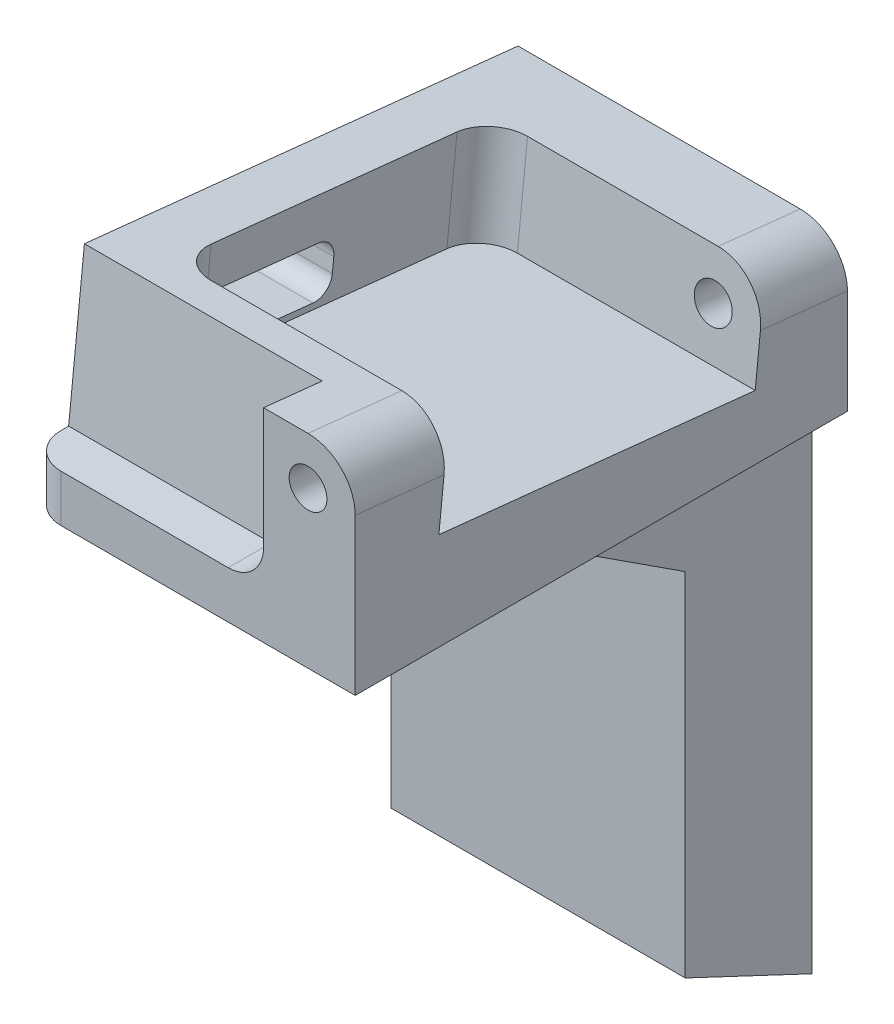
ISO-10303-21;
HEADER;
FILE_DESCRIPTION(('STEP AP214'),'2;1');
FILE_NAME('part.step','',(''),(''),'','','');
FILE_SCHEMA(('AUTOMOTIVE_DESIGN { 1 0 10303 214 1 1 1 1 }'));
ENDSEC;
DATA;
#1=APPLICATION_CONTEXT('core data for automotive mechanical design processes');
#2=APPLICATION_PROTOCOL_DEFINITION('international standard','automotive_design',2000,#1);
#3=PRODUCT_CONTEXT('',#1,'mechanical');
#4=PRODUCT('Part','Part','',(#3));
#5=PRODUCT_RELATED_PRODUCT_CATEGORY('part','',(#4));
#6=PRODUCT_DEFINITION_FORMATION('','',#4);
#7=PRODUCT_DEFINITION_CONTEXT('part definition',#1,'design');
#8=PRODUCT_DEFINITION('design','',#6,#7);
#9=PRODUCT_DEFINITION_SHAPE('','',#8);
#10=(LENGTH_UNIT() NAMED_UNIT(*) SI_UNIT(.MILLI.,.METRE.));
#11=(NAMED_UNIT(*) PLANE_ANGLE_UNIT() SI_UNIT($,.RADIAN.));
#12=(NAMED_UNIT(*) SI_UNIT($,.STERADIAN.) SOLID_ANGLE_UNIT());
#13=UNCERTAINTY_MEASURE_WITH_UNIT(LENGTH_MEASURE(1.E-05),#10,'distance_accuracy_value','');
#14=(GEOMETRIC_REPRESENTATION_CONTEXT(3) GLOBAL_UNCERTAINTY_ASSIGNED_CONTEXT((#13)) GLOBAL_UNIT_ASSIGNED_CONTEXT((#10,
#11,#12)) REPRESENTATION_CONTEXT('',''));
#15=CARTESIAN_POINT('',(0.,0.,0.));
#16=DIRECTION('',(0.,0.,1.));
#17=DIRECTION('',(1.,0.,0.));
#18=AXIS2_PLACEMENT_3D('',#15,#16,#17);
#19=CARTESIAN_POINT('',(11.47,215.631716961282,93.648194247594));
#20=DIRECTION('',(0.,0.10452846326765,0.994521895368274));
#21=DIRECTION('',(0.,-0.994521895368274,0.10452846326765));
#22=AXIS2_PLACEMENT_3D('',#19,#20,#21);
#23=CYLINDRICAL_SURFACE('',#22,3.99999999999999);
#24=DIRECTION('',(0.,0.10452846326765,0.994521895368274));
#25=VECTOR('',#24,1.);
#26=CARTESIAN_POINT('',(15.47,215.587771424514,93.2300803945325));
#27=LINE('',#26,#25);
#28=CARTESIAN_POINT('',(15.47,219.185684712395,127.461938690124));
#29=VERTEX_POINT('',#28);
#30=CARTESIAN_POINT('',(15.47,219.977966881755,135.));
#31=VERTEX_POINT('',#30);
#32=EDGE_CURVE('E461',#29,#31,#27,.T.);
#33=ORIENTED_EDGE('',*,*,#32,.F.);
#34=CARTESIAN_POINT('',(11.47,219.185684712384,127.461938690125));
#35=DIRECTION('',(0.,0.10452846326765,0.994521895368274));
#36=DIRECTION('',(0.,-0.994521895368274,0.10452846326765));
#37=AXIS2_PLACEMENT_3D('',#34,#35,#36);
#38=CIRCLE('',#37,3.99999999999999);
#39=CARTESIAN_POINT('',(11.47,223.163772293859,127.043824837054));
#40=VERTEX_POINT('',#39);
#41=EDGE_CURVE('E365',#29,#40,#38,.T.);
#42=ORIENTED_EDGE('',*,*,#41,.T.);
#43=DIRECTION('',(0.,0.10452846326765,0.994521895368274));
#44=VECTOR('',#43,1.);
#45=CARTESIAN_POINT('',(11.47,224.,135.));
#46=LINE('',#45,#44);
#47=CARTESIAN_POINT('',(11.47,223.999999999997,134.999999999991));
#48=VERTEX_POINT('',#47);
#49=EDGE_CURVE('E475',#40,#48,#46,.T.);
#50=ORIENTED_EDGE('',*,*,#49,.T.);
#51=CARTESIAN_POINT('',(11.47,223.999999999997,134.999999999991));
#52=CARTESIAN_POINT('',(13.8131457505076,223.999999999997,134.999999999991));
#53=CARTESIAN_POINT('',(15.47,222.334019334102,134.999999999991));
#54=CARTESIAN_POINT('',(15.47,219.977966881743,134.999999999991));
#55=(BOUNDED_CURVE() B_SPLINE_CURVE(3,(#51,#52,#53,#54),.UNSPECIFIED.,.F.,
.F.) B_SPLINE_CURVE_WITH_KNOTS((4,4),(0.,1.),
.UNSPECIFIED.) CURVE() GEOMETRIC_REPRESENTATION_ITEM() RATIONAL_B_SPLINE_CURVE((1.,
0.804737854124365,0.804737854124365,1.)) REPRESENTATION_ITEM(''));
#56=EDGE_CURVE('E455',#48,#31,#55,.T.);
#57=ORIENTED_EDGE('',*,*,#56,.T.);
#58=EDGE_LOOP('',(#33,#42,#50,#57));
#59=FACE_BOUND('',#58,.T.);
#60=ADVANCED_FACE('F39',(#59),#23,.T.);
#61=CARTESIAN_POINT('',(11.47,215.11552041079,88.7369121361922));
#62=DIRECTION('',(0.,0.10452846326765,0.994521895368274));
#63=DIRECTION('',(0.,-0.994521895368274,0.10452846326765));
#64=AXIS2_PLACEMENT_3D('',#61,#62,#63);
#65=CYLINDRICAL_SURFACE('',#64,1.59999999999996);
#66=CARTESIAN_POINT('',(11.47,219.185684712384,127.461938690125));
#67=DIRECTION('',(0.,0.10452846326765,0.994521895368274));
#68=DIRECTION('',(0.,-0.994521895368274,0.10452846326765));
#69=AXIS2_PLACEMENT_3D('',#66,#67,#68);
#70=CIRCLE('',#69,1.59999999999996);
#71=CARTESIAN_POINT('',(11.47,217.594449679794,127.629184231353));
#72=VERTEX_POINT('',#71);
#73=EDGE_CURVE('E364',#72,#72,#70,.F.);
#74=ORIENTED_EDGE('',*,*,#73,.T.);
#75=EDGE_LOOP('',(#74));
#76=FACE_BOUND('',#75,.T.);
#77=CARTESIAN_POINT('',(11.47,219.977966881744,135.));
#78=DIRECTION('',(0.,0.,-1.));
#79=DIRECTION('',(0.,1.,0.));
#80=AXIS2_PLACEMENT_3D('',#77,#78,#79);
#81=ELLIPSE('',#80,1.60881324730159,1.59999999999996);
#82=CARTESIAN_POINT('',(11.47,221.586780129045,135.));
#83=VERTEX_POINT('',#82);
#84=EDGE_CURVE('E373',#83,#83,#81,.T.);
#85=ORIENTED_EDGE('',*,*,#84,.F.);
#86=EDGE_LOOP('',(#85));
#87=FACE_BOUND('',#86,.T.);
#88=ADVANCED_FACE('F642',(#76,#87),#65,.F.);
#89=CARTESIAN_POINT('',(11.47,206.75,135.));
#90=DIRECTION('',(0.,1.,0.));
#91=DIRECTION('',(0.,0.,1.));
#92=AXIS2_PLACEMENT_3D('',#89,#90,#91);
#93=PLANE('',#92);
#94=DIRECTION('',(-1.,0.,0.));
#95=VECTOR('',#94,1.);
#96=CARTESIAN_POINT('',(11.47,206.75,135.));
#97=LINE('',#96,#95);
#98=CARTESIAN_POINT('',(15.47,206.75,135.));
#99=VERTEX_POINT('',#98);
#100=CARTESIAN_POINT('',(-9.46999999999999,206.75,135.));
#101=VERTEX_POINT('',#100);
#102=EDGE_CURVE('E513',#99,#101,#97,.T.);
#103=ORIENTED_EDGE('',*,*,#102,.T.);
#104=CARTESIAN_POINT('',(-9.47,206.75,132.));
#105=DIRECTION('',(0.,1.,0.));
#106=DIRECTION('',(0.,0.,1.));
#107=AXIS2_PLACEMENT_3D('',#104,#105,#106);
#108=CIRCLE('',#107,3.);
#109=CARTESIAN_POINT('',(-12.47,206.75,132.));
#110=VERTEX_POINT('',#109);
#111=EDGE_CURVE('E524',#101,#110,#108,.F.);
#112=ORIENTED_EDGE('',*,*,#111,.T.);
#113=DIRECTION('',(0.,0.,-1.));
#114=VECTOR('',#113,1.);
#115=CARTESIAN_POINT('',(-12.47,206.75,135.));
#116=LINE('',#115,#114);
#117=CARTESIAN_POINT('',(-12.47,206.75,116.178095191841));
#118=VERTEX_POINT('',#117);
#119=EDGE_CURVE('E479',#110,#118,#116,.T.);
#120=ORIENTED_EDGE('',*,*,#119,.T.);
#121=DIRECTION('',(-1.,0.,0.));
#122=VECTOR('',#121,1.);
#123=CARTESIAN_POINT('',(11.47,206.75,116.178095191841));
#124=LINE('',#123,#122);
#125=CARTESIAN_POINT('',(12.47,206.75,116.178095191841));
#126=VERTEX_POINT('',#125);
#127=EDGE_CURVE('E509',#126,#118,#124,.T.);
#128=ORIENTED_EDGE('',*,*,#127,.F.);
#129=DIRECTION('',(0.,0.,1.));
#130=VECTOR('',#129,1.);
#131=CARTESIAN_POINT('',(12.47,206.75,116.178095191841));
#132=LINE('',#131,#130);
#133=CARTESIAN_POINT('',(12.47,206.75,93.2499999999999));
#134=VERTEX_POINT('',#133);
#135=EDGE_CURVE('E421',#134,#126,#132,.T.);
#136=ORIENTED_EDGE('',*,*,#135,.F.);
#137=DIRECTION('',(-1.,0.,0.));
#138=VECTOR('',#137,1.);
#139=CARTESIAN_POINT('',(15.47,206.75,93.2499999999999));
#140=LINE('',#139,#138);
#141=CARTESIAN_POINT('',(15.47,206.75,93.2499999999999));
#142=VERTEX_POINT('',#141);
#143=EDGE_CURVE('E448',#142,#134,#140,.T.);
#144=ORIENTED_EDGE('',*,*,#143,.F.);
#145=DIRECTION('',(0.,0.,-1.));
#146=VECTOR('',#145,1.);
#147=CARTESIAN_POINT('',(15.47,206.75,135.));
#148=LINE('',#147,#146);
#149=EDGE_CURVE('E441',#99,#142,#148,.T.);
#150=ORIENTED_EDGE('',*,*,#149,.F.);
#151=EDGE_LOOP('',(#103,#112,#120,#128,#136,#144,#150));
#152=FACE_BOUND('',#151,.T.);
#153=ADVANCED_FACE('F620',(#152),#93,.F.);
#154=CARTESIAN_POINT('',(11.47,219.611898177656,93.2500000000006));
#155=VERTEX_POINT('',#154);
#156=CARTESIAN_POINT('',(11.47,220.343597420532,100.211653267578));
#157=VERTEX_POINT('',#156);
#158=EDGE_CURVE('E470',#155,#157,#46,.T.);
#159=ORIENTED_EDGE('',*,*,#158,.T.);
#160=CARTESIAN_POINT('',(11.47,216.365509839056,100.629767120649));
#161=DIRECTION('',(0.,-0.10452846326765,-0.994521895368274));
#162=DIRECTION('',(0.,0.994521895368274,-0.10452846326765));
#163=AXIS2_PLACEMENT_3D('',#160,#161,#162);
#164=CIRCLE('',#163,3.99999999999999);
#165=CARTESIAN_POINT('',(15.47,216.365509839068,100.629767120648));
#166=VERTEX_POINT('',#165);
#167=EDGE_CURVE('E360',#157,#166,#164,.T.);
#168=ORIENTED_EDGE('',*,*,#167,.T.);
#169=CARTESIAN_POINT('',(15.47,215.589865059413,93.2500000000006));
#170=VERTEX_POINT('',#169);
#171=EDGE_CURVE('E462',#170,#166,#27,.T.);
#172=ORIENTED_EDGE('',*,*,#171,.F.);
#173=CARTESIAN_POINT('',(11.47,215.589865059402,93.2500000000006));
#174=DIRECTION('',(0.,0.,-1.));
#175=DIRECTION('',(0.,1.,0.));
#176=AXIS2_PLACEMENT_3D('',#173,#174,#175);
#177=ELLIPSE('',#176,4.02203311825406,3.99999999999999);
#178=EDGE_CURVE('E452',#155,#170,#177,.T.);
#179=ORIENTED_EDGE('',*,*,#178,.F.);
#180=EDGE_LOOP('',(#159,#168,#172,#179));
#181=FACE_BOUND('',#180,.T.);
#182=ADVANCED_FACE('F646',(#181),#23,.T.);
#183=CARTESIAN_POINT('',(11.47,224.,135.));
#184=DIRECTION('',(0.,-0.994521895368274,0.10452846326765));
#185=DIRECTION('',(0.,-0.10452846326765,-0.994521895368274));
#186=AXIS2_PLACEMENT_3D('',#183,#184,#185);
#187=PLANE('',#186);
#188=ORIENTED_EDGE('',*,*,#49,.F.);
#189=DIRECTION('',(1.,0.,0.));
#190=VECTOR('',#189,1.);
#191=CARTESIAN_POINT('',(15.47,223.163772293859,127.043824837054));
#192=LINE('',#191,#190);
#193=CARTESIAN_POINT('',(-4.7,223.163772293859,127.043824837054));
#194=VERTEX_POINT('',#193);
#195=EDGE_CURVE('E279',#194,#40,#192,.T.);
#196=ORIENTED_EDGE('',*,*,#195,.F.);
#197=CARTESIAN_POINT('',(-4.7,222.850186904056,124.060259150949));
#198=DIRECTION('',(0.,0.994521895368274,-0.10452846326765));
#199=DIRECTION('',(0.,-0.10452846326765,-0.994521895368274));
#200=AXIS2_PLACEMENT_3D('',#197,#198,#199);
#201=CIRCLE('',#200,3.00000000000001);
#202=CARTESIAN_POINT('',(-7.7,222.850186904056,124.060259150949));
#203=VERTEX_POINT('',#202);
#204=EDGE_CURVE('E300',#203,#194,#201,.T.);
#205=ORIENTED_EDGE('',*,*,#204,.F.);
#206=DIRECTION('',(0.,0.10452846326765,0.994521895368274));
#207=VECTOR('',#206,1.);
#208=CARTESIAN_POINT('',(-7.7,222.850186904056,124.060259150949));
#209=LINE('',#208,#207);
#210=CARTESIAN_POINT('',(-7.69999999999999,220.657182810335,103.195218953683));
#211=VERTEX_POINT('',#210);
#212=EDGE_CURVE('E330',#211,#203,#209,.T.);
#213=ORIENTED_EDGE('',*,*,#212,.F.);
#214=CARTESIAN_POINT('',(-4.7,220.657182810335,103.195218953683));
#215=DIRECTION('',(0.,0.994521895368274,-0.10452846326765));
#216=DIRECTION('',(0.,-0.10452846326765,-0.994521895368274));
#217=AXIS2_PLACEMENT_3D('',#214,#215,#216);
#218=CIRCLE('',#217,2.99999999999999);
#219=CARTESIAN_POINT('',(-4.7,220.343597420532,100.211653267578));
#220=VERTEX_POINT('',#219);
#221=EDGE_CURVE('E326',#220,#211,#218,.T.);
#222=ORIENTED_EDGE('',*,*,#221,.F.);
#223=DIRECTION('',(-1.,0.,0.));
#224=VECTOR('',#223,1.);
#225=CARTESIAN_POINT('',(15.47,220.343597420532,100.211653267578));
#226=LINE('',#225,#224);
#227=EDGE_CURVE('E323',#157,#220,#226,.T.);
#228=ORIENTED_EDGE('',*,*,#227,.F.);
#229=ORIENTED_EDGE('',*,*,#158,.F.);
#230=DIRECTION('',(-1.,0.,0.));
#231=VECTOR('',#230,1.);
#232=CARTESIAN_POINT('',(11.47,219.611898177658,93.2499999999999));
#233=LINE('',#232,#231);
#234=CARTESIAN_POINT('',(-12.47,219.611898177658,93.2499999999999));
#235=VERTEX_POINT('',#234);
#236=EDGE_CURVE('E474',#155,#235,#233,.T.);
#237=ORIENTED_EDGE('',*,*,#236,.T.);
#238=DIRECTION('',(0.,0.10452846326765,0.994521895368274));
#239=VECTOR('',#238,1.);
#240=CARTESIAN_POINT('',(-12.47,224.,135.));
#241=LINE('',#240,#239);
#242=CARTESIAN_POINT('',(-12.47,223.477357683662,130.027390523159));
#243=VERTEX_POINT('',#242);
#244=EDGE_CURVE('E469',#235,#243,#241,.T.);
#245=ORIENTED_EDGE('',*,*,#244,.T.);
#246=DIRECTION('',(-1.,0.,0.));
#247=VECTOR('',#246,1.);
#248=CARTESIAN_POINT('',(11.47,223.477357683662,130.027390523159));
#249=LINE('',#248,#247);
#250=CARTESIAN_POINT('',(7.69999999999997,223.477357683662,130.027390523159));
#251=VERTEX_POINT('',#250);
#252=EDGE_CURVE('E392',#251,#243,#249,.T.);
#253=ORIENTED_EDGE('',*,*,#252,.F.);
#254=DIRECTION('',(0.,0.10452846326765,0.994521895368274));
#255=VECTOR('',#254,1.);
#256=CARTESIAN_POINT('',(7.69999999999997,224.,135.));
#257=LINE('',#256,#255);
#258=CARTESIAN_POINT('',(7.69999999999997,223.999999999996,135.));
#259=VERTEX_POINT('',#258);
#260=EDGE_CURVE('E413',#251,#259,#257,.T.);
#261=ORIENTED_EDGE('',*,*,#260,.T.);
#262=DIRECTION('',(-1.,0.,0.));
#263=VECTOR('',#262,1.);
#264=CARTESIAN_POINT('',(11.47,224.,135.));
#265=LINE('',#264,#263);
#266=EDGE_CURVE('E517',#48,#259,#265,.T.);
#267=ORIENTED_EDGE('',*,*,#266,.F.);
#268=EDGE_LOOP('',(#188,#196,#205,#213,#222,#228,#229,#237,#245,#253,#261,#267));
#269=FACE_BOUND('',#268,.T.);
#270=ADVANCED_FACE('F582',(#269),#187,.F.);
#271=CARTESIAN_POINT('',(11.47,224.,135.));
#272=DIRECTION('',(0.,0.,-1.));
#273=DIRECTION('',(0.,1.,0.));
#274=AXIS2_PLACEMENT_3D('',#271,#272,#273);
#275=PLANE('',#274);
#276=ORIENTED_EDGE('',*,*,#84,.T.);
#277=EDGE_LOOP('',(#276));
#278=FACE_BOUND('',#277,.T.);
#279=ORIENTED_EDGE('',*,*,#266,.T.);
#280=DIRECTION('',(0.,1.,0.));
#281=VECTOR('',#280,1.);
#282=CARTESIAN_POINT('',(7.69999999999997,223.999999999996,135.));
#283=LINE('',#282,#281);
#284=CARTESIAN_POINT('',(7.69999999999997,213.75,135.));
#285=VERTEX_POINT('',#284);
#286=EDGE_CURVE('E377',#285,#259,#283,.T.);
#287=ORIENTED_EDGE('',*,*,#286,.F.);
#288=CARTESIAN_POINT('',(4.69999999999997,213.75,135.));
#289=DIRECTION('',(0.,0.,1.));
#290=DIRECTION('',(-1.,0.,0.));
#291=AXIS2_PLACEMENT_3D('',#288,#289,#290);
#292=CIRCLE('',#291,3.);
#293=CARTESIAN_POINT('',(4.69999999999997,210.75,135.));
#294=VERTEX_POINT('',#293);
#295=EDGE_CURVE('E398',#294,#285,#292,.T.);
#296=ORIENTED_EDGE('',*,*,#295,.F.);
#297=DIRECTION('',(1.,0.,0.));
#298=VECTOR('',#297,1.);
#299=CARTESIAN_POINT('',(-12.47,210.75,135.));
#300=LINE('',#299,#298);
#301=CARTESIAN_POINT('',(-9.47,210.75,135.));
#302=VERTEX_POINT('',#301);
#303=EDGE_CURVE('E395',#302,#294,#300,.T.);
#304=ORIENTED_EDGE('',*,*,#303,.F.);
#305=DIRECTION('',(0.,-1.,0.));
#306=VECTOR('',#305,1.);
#307=CARTESIAN_POINT('',(-9.47,206.75,135.));
#308=LINE('',#307,#306);
#309=EDGE_CURVE('E521',#302,#101,#308,.T.);
#310=ORIENTED_EDGE('',*,*,#309,.T.);
#311=ORIENTED_EDGE('',*,*,#102,.F.);
#312=DIRECTION('',(0.,-1.,0.));
#313=VECTOR('',#312,1.);
#314=CARTESIAN_POINT('',(15.47,219.977966881755,135.));
#315=LINE('',#314,#313);
#316=EDGE_CURVE('E437',#31,#99,#315,.T.);
#317=ORIENTED_EDGE('',*,*,#316,.F.);
#318=ORIENTED_EDGE('',*,*,#56,.F.);
#319=EDGE_LOOP('',(#279,#287,#296,#304,#310,#311,#317,#318));
#320=FACE_BOUND('',#319,.T.);
#321=ADVANCED_FACE('F594',(#278,#320),#275,.F.);
#322=CARTESIAN_POINT('',(11.47,206.75,116.178095191841));
#323=DIRECTION('',(0.,0.838837364564142,-0.544382104602167));
#324=DIRECTION('',(0.,0.544382104602167,0.838837364564142));
#325=AXIS2_PLACEMENT_3D('',#322,#323,#324);
#326=PLANE('',#325);
#327=DIRECTION('',(0.,-0.544382104602167,-0.838837364564142));
#328=VECTOR('',#327,1.);
#329=CARTESIAN_POINT('',(-12.47,206.75,116.178095191841));
#330=LINE('',#329,#328);
#331=CARTESIAN_POINT('',(-12.47,198.85,104.005));
#332=VERTEX_POINT('',#331);
#333=EDGE_CURVE('E482',#118,#332,#330,.T.);
#334=ORIENTED_EDGE('',*,*,#333,.T.);
#335=DIRECTION('',(-1.,0.,0.));
#336=VECTOR('',#335,1.);
#337=CARTESIAN_POINT('',(11.47,198.85,104.005));
#338=LINE('',#337,#336);
#339=CARTESIAN_POINT('',(12.47,198.85,104.005));
#340=VERTEX_POINT('',#339);
#341=EDGE_CURVE('E505',#340,#332,#338,.T.);
#342=ORIENTED_EDGE('',*,*,#341,.F.);
#343=DIRECTION('',(0.,-0.544382104602167,-0.838837364564142));
#344=VECTOR('',#343,1.);
#345=CARTESIAN_POINT('',(12.47,198.85,104.005));
#346=LINE('',#345,#344);
#347=EDGE_CURVE('E425',#126,#340,#346,.T.);
#348=ORIENTED_EDGE('',*,*,#347,.F.);
#349=ORIENTED_EDGE('',*,*,#127,.T.);
#350=EDGE_LOOP('',(#334,#342,#348,#349));
#351=FACE_BOUND('',#350,.T.);
#352=ADVANCED_FACE('F702',(#351),#326,.F.);
#353=CARTESIAN_POINT('',(11.47,198.85,104.005));
#354=DIRECTION('',(0.,0.,-1.));
#355=DIRECTION('',(-1.,0.,0.));
#356=AXIS2_PLACEMENT_3D('',#353,#354,#355);
#357=PLANE('',#356);
#358=DIRECTION('',(0.,-1.,0.));
#359=VECTOR('',#358,1.);
#360=CARTESIAN_POINT('',(-12.47,198.85,104.005));
#361=LINE('',#360,#359);
#362=CARTESIAN_POINT('',(-12.47,168.99910250957,104.005));
#363=VERTEX_POINT('',#362);
#364=EDGE_CURVE('E485',#332,#363,#361,.T.);
#365=ORIENTED_EDGE('',*,*,#364,.T.);
#366=DIRECTION('',(-1.,0.,0.));
#367=VECTOR('',#366,1.);
#368=CARTESIAN_POINT('',(11.47,168.99910250957,104.005));
#369=LINE('',#368,#367);
#370=CARTESIAN_POINT('',(12.47,168.99910250957,104.005));
#371=VERTEX_POINT('',#370);
#372=EDGE_CURVE('E501',#371,#363,#369,.T.);
#373=ORIENTED_EDGE('',*,*,#372,.F.);
#374=DIRECTION('',(0.,-1.,0.));
#375=VECTOR('',#374,1.);
#376=CARTESIAN_POINT('',(12.47,168.99910250957,104.005));
#377=LINE('',#376,#375);
#378=EDGE_CURVE('E429',#340,#371,#377,.T.);
#379=ORIENTED_EDGE('',*,*,#378,.F.);
#380=ORIENTED_EDGE('',*,*,#341,.T.);
#381=EDGE_LOOP('',(#365,#373,#379,#380));
#382=FACE_BOUND('',#381,.T.);
#383=ADVANCED_FACE('F698',(#382),#357,.F.);
#384=CARTESIAN_POINT('',(11.47,168.99910250957,104.005));
#385=DIRECTION('',(0.,0.904574398814679,-0.426315794932655));
#386=DIRECTION('',(0.,0.426315794932655,0.90457439881468));
#387=AXIS2_PLACEMENT_3D('',#384,#385,#386);
#388=PLANE('',#387);
#389=DIRECTION('',(0.,-0.426315794932655,-0.904574398814679));
#390=VECTOR('',#389,1.);
#391=CARTESIAN_POINT('',(-12.47,168.99910250957,104.005));
#392=LINE('',#391,#390);
#393=CARTESIAN_POINT('',(-12.47,163.930391322841,93.2499999999999));
#394=VERTEX_POINT('',#393);
#395=EDGE_CURVE('E488',#363,#394,#392,.T.);
#396=ORIENTED_EDGE('',*,*,#395,.T.);
#397=DIRECTION('',(-1.,0.,0.));
#398=VECTOR('',#397,1.);
#399=CARTESIAN_POINT('',(11.47,163.930391322841,93.2499999999999));
#400=LINE('',#399,#398);
#401=CARTESIAN_POINT('',(12.47,163.930391322841,93.2499999999999));
#402=VERTEX_POINT('',#401);
#403=EDGE_CURVE('E497',#402,#394,#400,.T.);
#404=ORIENTED_EDGE('',*,*,#403,.F.);
#405=DIRECTION('',(0.,-0.426315794932655,-0.904574398814679));
#406=VECTOR('',#405,1.);
#407=CARTESIAN_POINT('',(12.47,163.930391322841,93.2499999999999));
#408=LINE('',#407,#406);
#409=EDGE_CURVE('E433',#371,#402,#408,.T.);
#410=ORIENTED_EDGE('',*,*,#409,.F.);
#411=ORIENTED_EDGE('',*,*,#372,.T.);
#412=EDGE_LOOP('',(#396,#404,#410,#411));
#413=FACE_BOUND('',#412,.T.);
#414=ADVANCED_FACE('F692',(#413),#388,.F.);
#415=CARTESIAN_POINT('',(11.47,219.611898177658,93.2499999999999));
#416=DIRECTION('',(0.,0.,1.));
#417=DIRECTION('',(1.,0.,0.));
#418=AXIS2_PLACEMENT_3D('',#415,#416,#417);
#419=PLANE('',#418);
#420=CARTESIAN_POINT('',(11.47,215.589865059402,93.2499999999999));
#421=DIRECTION('',(0.,0.,1.));
#422=DIRECTION('',(0.,1.,0.));
#423=AXIS2_PLACEMENT_3D('',#420,#421,#422);
#424=ELLIPSE('',#423,1.60881324730159,1.59999999999996);
#425=CARTESIAN_POINT('',(11.47,217.198678306703,93.2499999999999));
#426=VERTEX_POINT('',#425);
#427=EDGE_CURVE('E369',#426,#426,#424,.F.);
#428=ORIENTED_EDGE('',*,*,#427,.F.);
#429=EDGE_LOOP('',(#428));
#430=FACE_BOUND('',#429,.T.);
#431=DIRECTION('',(0.,1.,0.));
#432=VECTOR('',#431,1.);
#433=CARTESIAN_POINT('',(-12.47,219.611898177658,93.2499999999999));
#434=LINE('',#433,#432);
#435=EDGE_CURVE('E491',#394,#235,#434,.T.);
#436=ORIENTED_EDGE('',*,*,#435,.T.);
#437=ORIENTED_EDGE('',*,*,#236,.F.);
#438=ORIENTED_EDGE('',*,*,#178,.T.);
#439=DIRECTION('',(0.,1.,0.));
#440=VECTOR('',#439,1.);
#441=CARTESIAN_POINT('',(15.47,206.75,93.2499999999999));
#442=LINE('',#441,#440);
#443=EDGE_CURVE('E444',#142,#170,#442,.T.);
#444=ORIENTED_EDGE('',*,*,#443,.F.);
#445=ORIENTED_EDGE('',*,*,#143,.T.);
#446=DIRECTION('',(0.,1.,0.));
#447=VECTOR('',#446,1.);
#448=CARTESIAN_POINT('',(12.47,206.75,93.2499999999999));
#449=LINE('',#448,#447);
#450=EDGE_CURVE('E417',#402,#134,#449,.T.);
#451=ORIENTED_EDGE('',*,*,#450,.F.);
#452=ORIENTED_EDGE('',*,*,#403,.T.);
#453=EDGE_LOOP('',(#436,#437,#438,#444,#445,#451,#452));
#454=FACE_BOUND('',#453,.T.);
#455=ADVANCED_FACE('F666',(#430,#454),#419,.F.);
#456=CARTESIAN_POINT('',(-12.47,0.,0.));
#457=DIRECTION('',(-1.,0.,0.));
#458=DIRECTION('',(0.,0.,1.));
#459=AXIS2_PLACEMENT_3D('',#456,#457,#458);
#460=PLANE('',#459);
#461=CARTESIAN_POINT('',(-12.47,217.720784732313,123.091118624235));
#462=DIRECTION('',(-1.,0.,0.));
#463=DIRECTION('',(0.,0.,-1.));
#464=AXIS2_PLACEMENT_3D('',#461,#462,#463);
#465=CIRCLE('',#464,1.50000000000001);
#466=CARTESIAN_POINT('',(-12.47,217.877577427215,124.582901467287));
#467=VERTEX_POINT('',#466);
#468=CARTESIAN_POINT('',(-12.47,219.212567575366,122.934325929333));
#469=VERTEX_POINT('',#468);
#470=EDGE_CURVE('E55',#467,#469,#465,.T.);
#471=ORIENTED_EDGE('',*,*,#470,.F.);
#472=DIRECTION('',(0.,0.994521895368274,-0.10452846326765));
#473=VECTOR('',#472,1.);
#474=CARTESIAN_POINT('',(-12.47,217.877577427215,124.582901467287));
#475=LINE('',#474,#473);
#476=CARTESIAN_POINT('',(-12.47,216.684151152773,124.708335623208));
#477=VERTEX_POINT('',#476);
#478=EDGE_CURVE('E272',#477,#467,#475,.T.);
#479=ORIENTED_EDGE('',*,*,#478,.F.);
#480=CARTESIAN_POINT('',(-12.47,216.527358457871,123.216552780156));
#481=DIRECTION('',(-1.,0.,0.));
#482=DIRECTION('',(0.,0.,-1.));
#483=AXIS2_PLACEMENT_3D('',#480,#481,#482);
#484=CIRCLE('',#483,1.50000000000001);
#485=CARTESIAN_POINT('',(-12.47,215.035575614819,123.373345475058));
#486=VERTEX_POINT('',#485);
#487=EDGE_CURVE('E268',#486,#477,#484,.T.);
#488=ORIENTED_EDGE('',*,*,#487,.F.);
#489=DIRECTION('',(0.,0.104528463267646,0.994521895368274));
#490=VECTOR('',#489,1.);
#491=CARTESIAN_POINT('',(-12.47,215.035575614819,123.373345475058));
#492=LINE('',#491,#490);
#493=CARTESIAN_POINT('',(-12.47,214.199347908678,115.417170312111));
#494=VERTEX_POINT('',#493);
#495=EDGE_CURVE('E264',#494,#486,#492,.T.);
#496=ORIENTED_EDGE('',*,*,#495,.F.);
#497=CARTESIAN_POINT('',(-12.47,215.69113075173,115.26037761721));
#498=DIRECTION('',(-1.,0.,0.));
#499=DIRECTION('',(0.,0.,-1.));
#500=AXIS2_PLACEMENT_3D('',#497,#498,#499);
#501=CIRCLE('',#500,1.49999999999998);
#502=CARTESIAN_POINT('',(-12.47,215.534338056828,113.768594774157));
#503=VERTEX_POINT('',#502);
#504=EDGE_CURVE('E257',#503,#494,#501,.T.);
#505=ORIENTED_EDGE('',*,*,#504,.F.);
#506=DIRECTION('',(0.,-0.994521895368274,0.104528463267648));
#507=VECTOR('',#506,1.);
#508=CARTESIAN_POINT('',(-12.47,216.72776433127,113.643160618236));
#509=LINE('',#508,#507);
#510=CARTESIAN_POINT('',(-12.47,216.72776433127,113.643160618236));
#511=VERTEX_POINT('',#510);
#512=EDGE_CURVE('E253',#511,#503,#509,.T.);
#513=ORIENTED_EDGE('',*,*,#512,.F.);
#514=CARTESIAN_POINT('',(-12.47,216.884557026172,115.134943461289));
#515=DIRECTION('',(-1.,0.,0.));
#516=DIRECTION('',(0.,0.,-1.));
#517=AXIS2_PLACEMENT_3D('',#514,#515,#516);
#518=CIRCLE('',#517,1.49999999999999);
#519=CARTESIAN_POINT('',(-12.47,218.376339869224,114.978150766387));
#520=VERTEX_POINT('',#519);
#521=EDGE_CURVE('E234',#520,#511,#518,.T.);
#522=ORIENTED_EDGE('',*,*,#521,.F.);
#523=DIRECTION('',(0.,-0.104528463267656,-0.994521895368273));
#524=VECTOR('',#523,1.);
#525=CARTESIAN_POINT('',(-12.47,219.212567575365,122.934325929333));
#526=LINE('',#525,#524);
#527=EDGE_CURVE('E244',#469,#520,#526,.T.);
#528=ORIENTED_EDGE('',*,*,#527,.F.);
#529=EDGE_LOOP('',(#471,#479,#488,#496,#505,#513,#522,#528));
#530=FACE_BOUND('',#529,.T.);
#531=DIRECTION('',(0.,0.,1.));
#532=VECTOR('',#531,1.);
#533=CARTESIAN_POINT('',(-12.47,210.75,106.469522266352));
#534=LINE('',#533,#532);
#535=CARTESIAN_POINT('',(-12.47,210.75,131.365089719453));
#536=VERTEX_POINT('',#535);
#537=CARTESIAN_POINT('',(-12.47,210.75,132.));
#538=VERTEX_POINT('',#537);
#539=EDGE_CURVE('E402',#536,#538,#534,.T.);
#540=ORIENTED_EDGE('',*,*,#539,.F.);
#541=DIRECTION('',(0.,0.994521895368274,-0.10452846326765));
#542=VECTOR('',#541,1.);
#543=CARTESIAN_POINT('',(-12.47,226.443267616378,129.715660827814));
#544=LINE('',#543,#542);
#545=EDGE_CURVE('E378',#536,#243,#544,.T.);
#546=ORIENTED_EDGE('',*,*,#545,.T.);
#547=ORIENTED_EDGE('',*,*,#244,.F.);
#548=ORIENTED_EDGE('',*,*,#435,.F.);
#549=ORIENTED_EDGE('',*,*,#395,.F.);
#550=ORIENTED_EDGE('',*,*,#364,.F.);
#551=ORIENTED_EDGE('',*,*,#333,.F.);
#552=ORIENTED_EDGE('',*,*,#119,.F.);
#553=DIRECTION('',(0.,-1.,0.));
#554=VECTOR('',#553,1.);
#555=CARTESIAN_POINT('',(-12.47,224.,132.));
#556=LINE('',#555,#554);
#557=EDGE_CURVE('E527',#110,#538,#556,.F.);
#558=ORIENTED_EDGE('',*,*,#557,.T.);
#559=EDGE_LOOP('',(#540,#546,#547,#548,#549,#550,#551,#552,#558));
#560=FACE_BOUND('',#559,.T.);
#561=ADVANCED_FACE('F249',(#530,#560),#460,.T.);
#562=CARTESIAN_POINT('',(15.47,0.,0.));
#563=DIRECTION('',(1.,0.,0.));
#564=DIRECTION('',(0.,0.,-1.));
#565=AXIS2_PLACEMENT_3D('',#562,#563,#564);
#566=PLANE('',#565);
#567=DIRECTION('',(0.,0.994521895368274,-0.10452846326765));
#568=VECTOR('',#567,1.);
#569=CARTESIAN_POINT('',(15.47,215.008692751839,127.900958235849));
#570=LINE('',#569,#568);
#571=CARTESIAN_POINT('',(15.47,215.008692751839,127.900958235849));
#572=VERTEX_POINT('',#571);
#573=EDGE_CURVE('E320',#572,#29,#570,.T.);
#574=ORIENTED_EDGE('',*,*,#573,.T.);
#575=ORIENTED_EDGE('',*,*,#32,.T.);
#576=ORIENTED_EDGE('',*,*,#316,.T.);
#577=ORIENTED_EDGE('',*,*,#149,.T.);
#578=ORIENTED_EDGE('',*,*,#443,.T.);
#579=ORIENTED_EDGE('',*,*,#171,.T.);
#580=DIRECTION('',(0.,0.994521895368274,-0.10452846326765));
#581=VECTOR('',#580,1.);
#582=CARTESIAN_POINT('',(15.47,212.188517878512,101.068786666373));
#583=LINE('',#582,#581);
#584=CARTESIAN_POINT('',(15.47,212.188517878512,101.068786666373));
#585=VERTEX_POINT('',#584);
#586=EDGE_CURVE('E354',#585,#166,#583,.T.);
#587=ORIENTED_EDGE('',*,*,#586,.F.);
#588=DIRECTION('',(0.,-0.104528463267651,-0.994521895368274));
#589=VECTOR('',#588,1.);
#590=CARTESIAN_POINT('',(15.47,215.008692751839,127.900958235849));
#591=LINE('',#590,#589);
#592=EDGE_CURVE('E299',#572,#585,#591,.T.);
#593=ORIENTED_EDGE('',*,*,#592,.F.);
#594=EDGE_LOOP('',(#574,#575,#576,#577,#578,#579,#587,#593));
#595=FACE_BOUND('',#594,.T.);
#596=ADVANCED_FACE('F623',(#595),#566,.T.);
#597=CARTESIAN_POINT('',(12.47,0.,0.));
#598=DIRECTION('',(1.,0.,0.));
#599=DIRECTION('',(0.,0.,-1.));
#600=AXIS2_PLACEMENT_3D('',#597,#598,#599);
#601=PLANE('',#600);
#602=ORIENTED_EDGE('',*,*,#450,.T.);
#603=ORIENTED_EDGE('',*,*,#135,.T.);
#604=ORIENTED_EDGE('',*,*,#347,.T.);
#605=ORIENTED_EDGE('',*,*,#378,.T.);
#606=ORIENTED_EDGE('',*,*,#409,.T.);
#607=EDGE_LOOP('',(#602,#603,#604,#605,#606));
#608=FACE_BOUND('',#607,.T.);
#609=ADVANCED_FACE('F682',(#608),#601,.T.);
#610=CARTESIAN_POINT('',(-9.47,224.,132.));
#611=DIRECTION('',(0.,1.,0.));
#612=DIRECTION('',(0.,0.,1.));
#613=AXIS2_PLACEMENT_3D('',#610,#611,#612);
#614=CYLINDRICAL_SURFACE('',#613,3.);
#615=CARTESIAN_POINT('',(-9.47,210.75,132.));
#616=DIRECTION('',(0.,-1.,0.));
#617=DIRECTION('',(0.,0.,-1.));
#618=AXIS2_PLACEMENT_3D('',#615,#616,#617);
#619=CIRCLE('',#618,3.);
#620=EDGE_CURVE('E531',#538,#302,#619,.F.);
#621=ORIENTED_EDGE('',*,*,#620,.F.);
#622=ORIENTED_EDGE('',*,*,#557,.F.);
#623=ORIENTED_EDGE('',*,*,#111,.F.);
#624=ORIENTED_EDGE('',*,*,#309,.F.);
#625=EDGE_LOOP('',(#621,#622,#623,#624));
#626=FACE_BOUND('',#625,.T.);
#627=ADVANCED_FACE('F41',(#626),#614,.T.);
#628=CARTESIAN_POINT('',(7.69999999999997,223.999999999996,106.469522266352));
#629=DIRECTION('',(1.,0.,0.));
#630=DIRECTION('',(0.,1.,0.));
#631=AXIS2_PLACEMENT_3D('',#628,#629,#630);
#632=PLANE('',#631);
#633=DIRECTION('',(0.,-0.994521895368274,0.10452846326765));
#634=VECTOR('',#633,1.);
#635=CARTESIAN_POINT('',(7.69999999999997,226.443267616378,129.715660827814));
#636=LINE('',#635,#634);
#637=CARTESIAN_POINT('',(7.69999999999997,213.75,131.049777013656));
#638=VERTEX_POINT('',#637);
#639=EDGE_CURVE('E389',#251,#638,#636,.T.);
#640=ORIENTED_EDGE('',*,*,#639,.T.);
#641=DIRECTION('',(0.,0.,1.));
#642=VECTOR('',#641,1.);
#643=CARTESIAN_POINT('',(7.69999999999997,213.75,106.469522266352));
#644=LINE('',#643,#642);
#645=EDGE_CURVE('E383',#638,#285,#644,.T.);
#646=ORIENTED_EDGE('',*,*,#645,.T.);
#647=ORIENTED_EDGE('',*,*,#286,.T.);
#648=ORIENTED_EDGE('',*,*,#260,.F.);
#649=EDGE_LOOP('',(#640,#646,#647,#648));
#650=FACE_BOUND('',#649,.T.);
#651=ADVANCED_FACE('F599',(#650),#632,.F.);
#652=CARTESIAN_POINT('',(11.47,223.477357683662,130.027390523159));
#653=DIRECTION('',(0.,0.10452846326765,0.994521895368274));
#654=DIRECTION('',(0.,-0.994521895368274,0.10452846326765));
#655=AXIS2_PLACEMENT_3D('',#652,#653,#654);
#656=PLANE('',#655);
#657=ORIENTED_EDGE('',*,*,#252,.T.);
#658=ORIENTED_EDGE('',*,*,#545,.F.);
#659=DIRECTION('',(-1.,0.,0.));
#660=VECTOR('',#659,1.);
#661=CARTESIAN_POINT('',(-12.47,210.75,131.365089719453));
#662=LINE('',#661,#660);
#663=CARTESIAN_POINT('',(4.69999999999997,210.75,131.365089719453));
#664=VERTEX_POINT('',#663);
#665=EDGE_CURVE('E382',#664,#536,#662,.T.);
#666=ORIENTED_EDGE('',*,*,#665,.F.);
#667=CARTESIAN_POINT('',(4.69999999999997,213.75,131.049777013656));
#668=DIRECTION('',(0.,0.10452846326765,0.994521895368274));
#669=DIRECTION('',(0.,-0.994521895368274,0.10452846326765));
#670=AXIS2_PLACEMENT_3D('',#667,#668,#669);
#671=ELLIPSE('',#670,3.01652483869055,3.);
#672=EDGE_CURVE('E386',#638,#664,#671,.F.);
#673=ORIENTED_EDGE('',*,*,#672,.F.);
#674=ORIENTED_EDGE('',*,*,#639,.F.);
#675=EDGE_LOOP('',(#657,#658,#666,#673,#674));
#676=FACE_BOUND('',#675,.T.);
#677=ADVANCED_FACE('F602',(#676),#656,.T.);
#678=CARTESIAN_POINT('',(4.69999999999997,213.75,106.469522266352));
#679=DIRECTION('',(0.,0.,1.));
#680=DIRECTION('',(1.,0.,0.));
#681=AXIS2_PLACEMENT_3D('',#678,#679,#680);
#682=CYLINDRICAL_SURFACE('',#681,3.);
#683=ORIENTED_EDGE('',*,*,#672,.T.);
#684=DIRECTION('',(0.,0.,1.));
#685=VECTOR('',#684,1.);
#686=CARTESIAN_POINT('',(4.69999999999997,210.75,106.469522266352));
#687=LINE('',#686,#685);
#688=EDGE_CURVE('E405',#664,#294,#687,.T.);
#689=ORIENTED_EDGE('',*,*,#688,.T.);
#690=ORIENTED_EDGE('',*,*,#295,.T.);
#691=ORIENTED_EDGE('',*,*,#645,.F.);
#692=EDGE_LOOP('',(#683,#689,#690,#691));
#693=FACE_BOUND('',#692,.T.);
#694=ADVANCED_FACE('F608',(#693),#682,.F.);
#695=CARTESIAN_POINT('',(-12.47,210.75,106.469522266352));
#696=DIRECTION('',(0.,-1.,0.));
#697=DIRECTION('',(0.,0.,-1.));
#698=AXIS2_PLACEMENT_3D('',#695,#696,#697);
#699=PLANE('',#698);
#700=ORIENTED_EDGE('',*,*,#620,.T.);
#701=ORIENTED_EDGE('',*,*,#303,.T.);
#702=ORIENTED_EDGE('',*,*,#688,.F.);
#703=ORIENTED_EDGE('',*,*,#665,.T.);
#704=ORIENTED_EDGE('',*,*,#539,.T.);
#705=EDGE_LOOP('',(#700,#701,#702,#703,#704));
#706=FACE_BOUND('',#705,.T.);
#707=ADVANCED_FACE('F639',(#706),#699,.F.);
#708=CARTESIAN_POINT('',(11.47,216.365509839057,100.629767120649));
#709=DIRECTION('',(0.,-0.10452846326765,-0.994521895368274));
#710=DIRECTION('',(0.,0.994521895368274,-0.10452846326765));
#711=AXIS2_PLACEMENT_3D('',#708,#709,#710);
#712=CIRCLE('',#711,1.59999999999996);
#713=CARTESIAN_POINT('',(11.47,217.956744871646,100.462521579421));
#714=VERTEX_POINT('',#713);
#715=EDGE_CURVE('E340',#714,#714,#712,.F.);
#716=ORIENTED_EDGE('',*,*,#715,.T.);
#717=EDGE_LOOP('',(#716));
#718=FACE_BOUND('',#717,.T.);
#719=ORIENTED_EDGE('',*,*,#427,.T.);
#720=EDGE_LOOP('',(#719));
#721=FACE_BOUND('',#720,.T.);
#722=ADVANCED_FACE('F630',(#718,#721),#65,.F.);
#723=CARTESIAN_POINT('',(15.47,215.008692751839,127.900958235849));
#724=DIRECTION('',(0.,0.10452846326765,0.994521895368274));
#725=DIRECTION('',(0.,-0.994521895368274,0.10452846326765));
#726=AXIS2_PLACEMENT_3D('',#723,#724,#725);
#727=PLANE('',#726);
#728=ORIENTED_EDGE('',*,*,#73,.F.);
#729=EDGE_LOOP('',(#728));
#730=FACE_BOUND('',#729,.T.);
#731=ORIENTED_EDGE('',*,*,#573,.F.);
#732=DIRECTION('',(1.,0.,0.));
#733=VECTOR('',#732,1.);
#734=CARTESIAN_POINT('',(15.47,215.008692751839,127.900958235849));
#735=LINE('',#734,#733);
#736=CARTESIAN_POINT('',(-4.7,215.008692751839,127.900958235849));
#737=VERTEX_POINT('',#736);
#738=EDGE_CURVE('E296',#737,#572,#735,.T.);
#739=ORIENTED_EDGE('',*,*,#738,.F.);
#740=DIRECTION('',(0.,0.994521895368274,-0.10452846326765));
#741=VECTOR('',#740,1.);
#742=CARTESIAN_POINT('',(-4.7,215.008692751839,127.900958235849));
#743=LINE('',#742,#741);
#744=EDGE_CURVE('E337',#737,#194,#743,.T.);
#745=ORIENTED_EDGE('',*,*,#744,.T.);
#746=ORIENTED_EDGE('',*,*,#195,.T.);
#747=ORIENTED_EDGE('',*,*,#41,.F.);
#748=EDGE_LOOP('',(#731,#739,#745,#746,#747));
#749=FACE_BOUND('',#748,.T.);
#750=ADVANCED_FACE('F627',(#730,#749),#727,.F.);
#751=CARTESIAN_POINT('',(15.47,212.188517878512,101.068786666373));
#752=DIRECTION('',(0.,-0.10452846326765,-0.994521895368274));
#753=DIRECTION('',(0.,0.994521895368274,-0.10452846326765));
#754=AXIS2_PLACEMENT_3D('',#751,#752,#753);
#755=PLANE('',#754);
#756=ORIENTED_EDGE('',*,*,#715,.F.);
#757=EDGE_LOOP('',(#756));
#758=FACE_BOUND('',#757,.T.);
#759=ORIENTED_EDGE('',*,*,#227,.T.);
#760=DIRECTION('',(0.,0.994521895368274,-0.10452846326765));
#761=VECTOR('',#760,1.);
#762=CARTESIAN_POINT('',(-4.7,212.188517878512,101.068786666373));
#763=LINE('',#762,#761);
#764=CARTESIAN_POINT('',(-4.7,212.188517878512,101.068786666373));
#765=VERTEX_POINT('',#764);
#766=EDGE_CURVE('E350',#765,#220,#763,.T.);
#767=ORIENTED_EDGE('',*,*,#766,.F.);
#768=DIRECTION('',(-1.,0.,0.));
#769=VECTOR('',#768,1.);
#770=CARTESIAN_POINT('',(15.47,212.188517878512,101.068786666373));
#771=LINE('',#770,#769);
#772=EDGE_CURVE('E304',#585,#765,#771,.T.);
#773=ORIENTED_EDGE('',*,*,#772,.F.);
#774=ORIENTED_EDGE('',*,*,#586,.T.);
#775=ORIENTED_EDGE('',*,*,#167,.F.);
#776=EDGE_LOOP('',(#759,#767,#773,#774,#775));
#777=FACE_BOUND('',#776,.T.);
#778=ADVANCED_FACE('F629',(#758,#777),#755,.F.);
#779=CARTESIAN_POINT('',(-4.7,214.695107362036,124.917392549744));
#780=DIRECTION('',(0.,0.994521895368274,-0.10452846326765));
#781=DIRECTION('',(0.,0.10452846326765,0.994521895368274));
#782=AXIS2_PLACEMENT_3D('',#779,#780,#781);
#783=CYLINDRICAL_SURFACE('',#782,3.00000000000001);
#784=ORIENTED_EDGE('',*,*,#204,.T.);
#785=ORIENTED_EDGE('',*,*,#744,.F.);
#786=CARTESIAN_POINT('',(-4.7,214.695107362036,124.917392549744));
#787=DIRECTION('',(0.,0.994521895368274,-0.10452846326765));
#788=DIRECTION('',(0.,-0.10452846326765,-0.994521895368274));
#789=AXIS2_PLACEMENT_3D('',#786,#787,#788);
#790=CIRCLE('',#789,3.00000000000001);
#791=CARTESIAN_POINT('',(-7.7,214.695107362036,124.917392549744));
#792=VERTEX_POINT('',#791);
#793=EDGE_CURVE('E316',#792,#737,#790,.T.);
#794=ORIENTED_EDGE('',*,*,#793,.F.);
#795=DIRECTION('',(0.,0.994521895368274,-0.10452846326765));
#796=VECTOR('',#795,1.);
#797=CARTESIAN_POINT('',(-7.7,214.695107362036,124.917392549744));
#798=LINE('',#797,#796);
#799=CARTESIAN_POINT('',(-7.7,216.684151152773,124.708335623208));
#800=VERTEX_POINT('',#799);
#801=EDGE_CURVE('E341',#792,#800,#798,.T.);
#802=ORIENTED_EDGE('',*,*,#801,.T.);
#803=CARTESIAN_POINT('',(-7.7,217.877577427215,124.582901467287));
#804=VERTEX_POINT('',#803);
#805=EDGE_CURVE('E345',#800,#804,#798,.T.);
#806=ORIENTED_EDGE('',*,*,#805,.T.);
#807=EDGE_CURVE('E346',#804,#203,#798,.T.);
#808=ORIENTED_EDGE('',*,*,#807,.T.);
#809=EDGE_LOOP('',(#784,#785,#794,#802,#806,#808));
#810=FACE_BOUND('',#809,.T.);
#811=ADVANCED_FACE('F568',(#810),#783,.F.);
#812=CARTESIAN_POINT('',(-7.7,214.695107362036,124.917392549744));
#813=DIRECTION('',(-1.,0.,0.));
#814=DIRECTION('',(0.,0.,1.));
#815=AXIS2_PLACEMENT_3D('',#812,#813,#814);
#816=PLANE('',#815);
#817=ORIENTED_EDGE('',*,*,#807,.F.);
#818=CARTESIAN_POINT('',(-7.7,217.720784732313,123.091118624235));
#819=DIRECTION('',(-1.,0.,0.));
#820=DIRECTION('',(0.,0.,1.));
#821=AXIS2_PLACEMENT_3D('',#818,#819,#820);
#822=CIRCLE('',#821,1.50000000000001);
#823=CARTESIAN_POINT('',(-7.7,219.212567575365,122.934325929333));
#824=VERTEX_POINT('',#823);
#825=EDGE_CURVE('E11',#804,#824,#822,.T.);
#826=ORIENTED_EDGE('',*,*,#825,.T.);
#827=DIRECTION('',(0.,-0.104528463267656,-0.994521895368273));
#828=VECTOR('',#827,1.);
#829=CARTESIAN_POINT('',(-7.7,219.369360270267,124.426108772386));
#830=LINE('',#829,#828);
#831=CARTESIAN_POINT('',(-7.7,218.376339869224,114.978150766387));
#832=VERTEX_POINT('',#831);
#833=EDGE_CURVE('E534',#824,#832,#830,.T.);
#834=ORIENTED_EDGE('',*,*,#833,.T.);
#835=CARTESIAN_POINT('',(-7.7,216.884557026172,115.134943461289));
#836=DIRECTION('',(-1.,0.,0.));
#837=DIRECTION('',(0.,0.,1.));
#838=AXIS2_PLACEMENT_3D('',#835,#836,#837);
#839=CIRCLE('',#838,1.49999999999999);
#840=CARTESIAN_POINT('',(-7.7,216.72776433127,113.643160618236));
#841=VERTEX_POINT('',#840);
#842=EDGE_CURVE('E237',#832,#841,#839,.T.);
#843=ORIENTED_EDGE('',*,*,#842,.T.);
#844=DIRECTION('',(0.,-0.994521895368274,0.104528463267648));
#845=VECTOR('',#844,1.);
#846=CARTESIAN_POINT('',(-7.7,213.545294266092,113.977651700693));
#847=LINE('',#846,#845);
#848=CARTESIAN_POINT('',(-7.7,215.534338056828,113.768594774157));
#849=VERTEX_POINT('',#848);
#850=EDGE_CURVE('E545',#841,#849,#847,.T.);
#851=ORIENTED_EDGE('',*,*,#850,.T.);
#852=CARTESIAN_POINT('',(-7.7,215.69113075173,115.26037761721));
#853=DIRECTION('',(-1.,0.,0.));
#854=DIRECTION('',(0.,0.,1.));
#855=AXIS2_PLACEMENT_3D('',#852,#853,#854);
#856=CIRCLE('',#855,1.49999999999998);
#857=CARTESIAN_POINT('',(-7.7,214.199347908678,115.417170312111));
#858=VERTEX_POINT('',#857);
#859=EDGE_CURVE('E549',#849,#858,#856,.T.);
#860=ORIENTED_EDGE('',*,*,#859,.T.);
#861=DIRECTION('',(0.,0.104528463267646,0.994521895368274));
#862=VECTOR('',#861,1.);
#863=CARTESIAN_POINT('',(-7.7,215.19236830972,124.86512831811));
#864=LINE('',#863,#862);
#865=CARTESIAN_POINT('',(-7.7,215.035575614819,123.373345475058));
#866=VERTEX_POINT('',#865);
#867=EDGE_CURVE('E553',#858,#866,#864,.T.);
#868=ORIENTED_EDGE('',*,*,#867,.T.);
#869=CARTESIAN_POINT('',(-7.7,216.527358457871,123.216552780156));
#870=DIRECTION('',(-1.,0.,0.));
#871=DIRECTION('',(0.,0.,1.));
#872=AXIS2_PLACEMENT_3D('',#869,#870,#871);
#873=CIRCLE('',#872,1.50000000000001);
#874=EDGE_CURVE('E48',#866,#800,#873,.T.);
#875=ORIENTED_EDGE('',*,*,#874,.T.);
#876=ORIENTED_EDGE('',*,*,#801,.F.);
#877=DIRECTION('',(0.,0.10452846326765,0.994521895368274));
#878=VECTOR('',#877,1.);
#879=CARTESIAN_POINT('',(-7.7,214.695107362036,124.917392549744));
#880=LINE('',#879,#878);
#881=CARTESIAN_POINT('',(-7.69999999999999,212.502103268315,104.052352352478));
#882=VERTEX_POINT('',#881);
#883=EDGE_CURVE('E312',#882,#792,#880,.T.);
#884=ORIENTED_EDGE('',*,*,#883,.F.);
#885=DIRECTION('',(0.,0.994521895368274,-0.10452846326765));
#886=VECTOR('',#885,1.);
#887=CARTESIAN_POINT('',(-7.69999999999999,212.502103268315,104.052352352478));
#888=LINE('',#887,#886);
#889=EDGE_CURVE('E347',#882,#211,#888,.T.);
#890=ORIENTED_EDGE('',*,*,#889,.T.);
#891=ORIENTED_EDGE('',*,*,#212,.T.);
#892=EDGE_LOOP('',(#817,#826,#834,#843,#851,#860,#868,#875,#876,#884,#890,#891));
#893=FACE_BOUND('',#892,.T.);
#894=ADVANCED_FACE('F560',(#893),#816,.F.);
#895=CARTESIAN_POINT('',(-4.7,212.502103268315,104.052352352478));
#896=DIRECTION('',(0.,0.994521895368274,-0.10452846326765));
#897=DIRECTION('',(0.,0.10452846326765,0.994521895368274));
#898=AXIS2_PLACEMENT_3D('',#895,#896,#897);
#899=CYLINDRICAL_SURFACE('',#898,2.99999999999999);
#900=ORIENTED_EDGE('',*,*,#221,.T.);
#901=ORIENTED_EDGE('',*,*,#889,.F.);
#902=CARTESIAN_POINT('',(-4.7,212.502103268315,104.052352352478));
#903=DIRECTION('',(0.,0.994521895368274,-0.10452846326765));
#904=DIRECTION('',(0.,-0.10452846326765,-0.994521895368274));
#905=AXIS2_PLACEMENT_3D('',#902,#903,#904);
#906=CIRCLE('',#905,2.99999999999999);
#907=EDGE_CURVE('E308',#765,#882,#906,.T.);
#908=ORIENTED_EDGE('',*,*,#907,.F.);
#909=ORIENTED_EDGE('',*,*,#766,.T.);
#910=EDGE_LOOP('',(#900,#901,#908,#909));
#911=FACE_BOUND('',#910,.T.);
#912=ADVANCED_FACE('F578',(#911),#899,.F.);
#913=CARTESIAN_POINT('',(-4.7,214.695107362036,124.917392549744));
#914=DIRECTION('',(0.,-0.994521895368274,0.10452846326765));
#915=DIRECTION('',(0.,-0.10452846326765,-0.994521895368274));
#916=AXIS2_PLACEMENT_3D('',#913,#914,#915);
#917=PLANE('',#916);
#918=ORIENTED_EDGE('',*,*,#738,.T.);
#919=ORIENTED_EDGE('',*,*,#592,.T.);
#920=ORIENTED_EDGE('',*,*,#772,.T.);
#921=ORIENTED_EDGE('',*,*,#907,.T.);
#922=ORIENTED_EDGE('',*,*,#883,.T.);
#923=ORIENTED_EDGE('',*,*,#793,.T.);
#924=EDGE_LOOP('',(#918,#919,#920,#921,#922,#923));
#925=FACE_BOUND('',#924,.T.);
#926=ADVANCED_FACE('F571',(#925),#917,.F.);
#927=CARTESIAN_POINT('',(-2.47,217.720784732313,123.091118624235));
#928=DIRECTION('',(-1.,0.,0.));
#929=DIRECTION('',(0.,0.,1.));
#930=AXIS2_PLACEMENT_3D('',#927,#928,#929);
#931=CYLINDRICAL_SURFACE('',#930,1.50000000000001);
#932=DIRECTION('',(-1.,0.,0.));
#933=VECTOR('',#932,1.);
#934=CARTESIAN_POINT('',(-2.47,217.877577427215,124.582901467287));
#935=LINE('',#934,#933);
#936=EDGE_CURVE('E276',#804,#467,#935,.T.);
#937=ORIENTED_EDGE('',*,*,#936,.T.);
#938=ORIENTED_EDGE('',*,*,#470,.T.);
#939=DIRECTION('',(-1.,0.,0.));
#940=VECTOR('',#939,1.);
#941=CARTESIAN_POINT('',(-2.47,219.212567575365,122.934325929333));
#942=LINE('',#941,#940);
#943=EDGE_CURVE('E241',#824,#469,#942,.T.);
#944=ORIENTED_EDGE('',*,*,#943,.F.);
#945=ORIENTED_EDGE('',*,*,#825,.F.);
#946=EDGE_LOOP('',(#937,#938,#944,#945));
#947=FACE_BOUND('',#946,.T.);
#948=ADVANCED_FACE('F797',(#947),#931,.F.);
#949=CARTESIAN_POINT('',(-2.47,217.877577427215,124.582901467287));
#950=DIRECTION('',(0.,0.10452846326765,0.994521895368274));
#951=DIRECTION('',(0.,-0.994521895368274,0.10452846326765));
#952=AXIS2_PLACEMENT_3D('',#949,#950,#951);
#953=PLANE('',#952);
#954=DIRECTION('',(-1.,0.,0.));
#955=VECTOR('',#954,1.);
#956=CARTESIAN_POINT('',(-2.47,216.684151152773,124.708335623208));
#957=LINE('',#956,#955);
#958=EDGE_CURVE('E280',#800,#477,#957,.T.);
#959=ORIENTED_EDGE('',*,*,#958,.T.);
#960=ORIENTED_EDGE('',*,*,#478,.T.);
#961=ORIENTED_EDGE('',*,*,#936,.F.);
#962=ORIENTED_EDGE('',*,*,#805,.F.);
#963=EDGE_LOOP('',(#959,#960,#961,#962));
#964=FACE_BOUND('',#963,.T.);
#965=ADVANCED_FACE('F824',(#964),#953,.F.);
#966=CARTESIAN_POINT('',(-2.47,216.527358457871,123.216552780156));
#967=DIRECTION('',(-1.,0.,0.));
#968=DIRECTION('',(0.,0.,1.));
#969=AXIS2_PLACEMENT_3D('',#966,#967,#968);
#970=CYLINDRICAL_SURFACE('',#969,1.50000000000001);
#971=DIRECTION('',(-1.,0.,0.));
#972=VECTOR('',#971,1.);
#973=CARTESIAN_POINT('',(-2.47,215.035575614819,123.373345475058));
#974=LINE('',#973,#972);
#975=EDGE_CURVE('E283',#866,#486,#974,.T.);
#976=ORIENTED_EDGE('',*,*,#975,.T.);
#977=ORIENTED_EDGE('',*,*,#487,.T.);
#978=ORIENTED_EDGE('',*,*,#958,.F.);
#979=ORIENTED_EDGE('',*,*,#874,.F.);
#980=EDGE_LOOP('',(#976,#977,#978,#979));
#981=FACE_BOUND('',#980,.T.);
#982=ADVANCED_FACE('F833',(#981),#970,.F.);
#983=CARTESIAN_POINT('',(-2.47,215.035575614819,123.373345475058));
#984=DIRECTION('',(0.,-0.994521895368274,0.104528463267646));
#985=DIRECTION('',(0.,-0.104528463267646,-0.994521895368274));
#986=AXIS2_PLACEMENT_3D('',#983,#984,#985);
#987=PLANE('',#986);
#988=DIRECTION('',(-1.,0.,0.));
#989=VECTOR('',#988,1.);
#990=CARTESIAN_POINT('',(-2.47,214.199347908678,115.417170312111));
#991=LINE('',#990,#989);
#992=EDGE_CURVE('E286',#858,#494,#991,.T.);
#993=ORIENTED_EDGE('',*,*,#992,.T.);
#994=ORIENTED_EDGE('',*,*,#495,.T.);
#995=ORIENTED_EDGE('',*,*,#975,.F.);
#996=ORIENTED_EDGE('',*,*,#867,.F.);
#997=EDGE_LOOP('',(#993,#994,#995,#996));
#998=FACE_BOUND('',#997,.T.);
#999=ADVANCED_FACE('F843',(#998),#987,.F.);
#1000=CARTESIAN_POINT('',(-2.47,215.69113075173,115.26037761721));
#1001=DIRECTION('',(-1.,0.,0.));
#1002=DIRECTION('',(0.,0.,1.));
#1003=AXIS2_PLACEMENT_3D('',#1000,#1001,#1002);
#1004=CYLINDRICAL_SURFACE('',#1003,1.49999999999998);
#1005=DIRECTION('',(-1.,0.,0.));
#1006=VECTOR('',#1005,1.);
#1007=CARTESIAN_POINT('',(-2.47,215.534338056828,113.768594774157));
#1008=LINE('',#1007,#1006);
#1009=EDGE_CURVE('E289',#849,#503,#1008,.T.);
#1010=ORIENTED_EDGE('',*,*,#1009,.T.);
#1011=ORIENTED_EDGE('',*,*,#504,.T.);
#1012=ORIENTED_EDGE('',*,*,#992,.F.);
#1013=ORIENTED_EDGE('',*,*,#859,.F.);
#1014=EDGE_LOOP('',(#1010,#1011,#1012,#1013));
#1015=FACE_BOUND('',#1014,.T.);
#1016=ADVANCED_FACE('F852',(#1015),#1004,.F.);
#1017=CARTESIAN_POINT('',(-2.47,216.72776433127,113.643160618236));
#1018=DIRECTION('',(0.,-0.104528463267648,-0.994521895368274));
#1019=DIRECTION('',(0.,0.994521895368274,-0.104528463267648));
#1020=AXIS2_PLACEMENT_3D('',#1017,#1018,#1019);
#1021=PLANE('',#1020);
#1022=DIRECTION('',(-1.,0.,0.));
#1023=VECTOR('',#1022,1.);
#1024=CARTESIAN_POINT('',(-2.47,216.72776433127,113.643160618236));
#1025=LINE('',#1024,#1023);
#1026=EDGE_CURVE('E240',#841,#511,#1025,.T.);
#1027=ORIENTED_EDGE('',*,*,#1026,.T.);
#1028=ORIENTED_EDGE('',*,*,#512,.T.);
#1029=ORIENTED_EDGE('',*,*,#1009,.F.);
#1030=ORIENTED_EDGE('',*,*,#850,.F.);
#1031=EDGE_LOOP('',(#1027,#1028,#1029,#1030));
#1032=FACE_BOUND('',#1031,.T.);
#1033=ADVANCED_FACE('F862',(#1032),#1021,.F.);
#1034=CARTESIAN_POINT('',(-2.47,216.884557026172,115.134943461289));
#1035=DIRECTION('',(-1.,0.,0.));
#1036=DIRECTION('',(0.,0.,1.));
#1037=AXIS2_PLACEMENT_3D('',#1034,#1035,#1036);
#1038=CYLINDRICAL_SURFACE('',#1037,1.49999999999999);
#1039=DIRECTION('',(-1.,0.,0.));
#1040=VECTOR('',#1039,1.);
#1041=CARTESIAN_POINT('',(-2.47,218.376339869224,114.978150766387));
#1042=LINE('',#1041,#1040);
#1043=EDGE_CURVE('E63',#832,#520,#1042,.T.);
#1044=ORIENTED_EDGE('',*,*,#1043,.T.);
#1045=ORIENTED_EDGE('',*,*,#521,.T.);
#1046=ORIENTED_EDGE('',*,*,#1026,.F.);
#1047=ORIENTED_EDGE('',*,*,#842,.F.);
#1048=EDGE_LOOP('',(#1044,#1045,#1046,#1047));
#1049=FACE_BOUND('',#1048,.T.);
#1050=ADVANCED_FACE('F231',(#1049),#1038,.F.);
#1051=CARTESIAN_POINT('',(-2.47,219.212567575365,122.934325929333));
#1052=DIRECTION('',(0.,0.994521895368273,-0.104528463267656));
#1053=DIRECTION('',(0.,0.104528463267656,0.994521895368273));
#1054=AXIS2_PLACEMENT_3D('',#1051,#1052,#1053);
#1055=PLANE('',#1054);
#1056=ORIENTED_EDGE('',*,*,#943,.T.);
#1057=ORIENTED_EDGE('',*,*,#527,.T.);
#1058=ORIENTED_EDGE('',*,*,#1043,.F.);
#1059=ORIENTED_EDGE('',*,*,#833,.F.);
#1060=EDGE_LOOP('',(#1056,#1057,#1058,#1059));
#1061=FACE_BOUND('',#1060,.T.);
#1062=ADVANCED_FACE('F245',(#1061),#1055,.F.);
#1063=CLOSED_SHELL('',(#60,#88,#153,#182,#270,#321,#352,#383,#414,#455,#561,#596,#609,#627,#651,
#677,#694,#707,#722,#750,#778,#811,#894,#912,#926,#948,#965,#982,#999,#1016,#1033,#1050,#1062));
#1064=MANIFOLD_SOLID_BREP('B2',#1063);
#1065=ADVANCED_BREP_SHAPE_REPRESENTATION('',(#18,#1064),#14);
#1066=SHAPE_DEFINITION_REPRESENTATION(#9,#1065);
ENDSEC;
END-ISO-10303-21;
